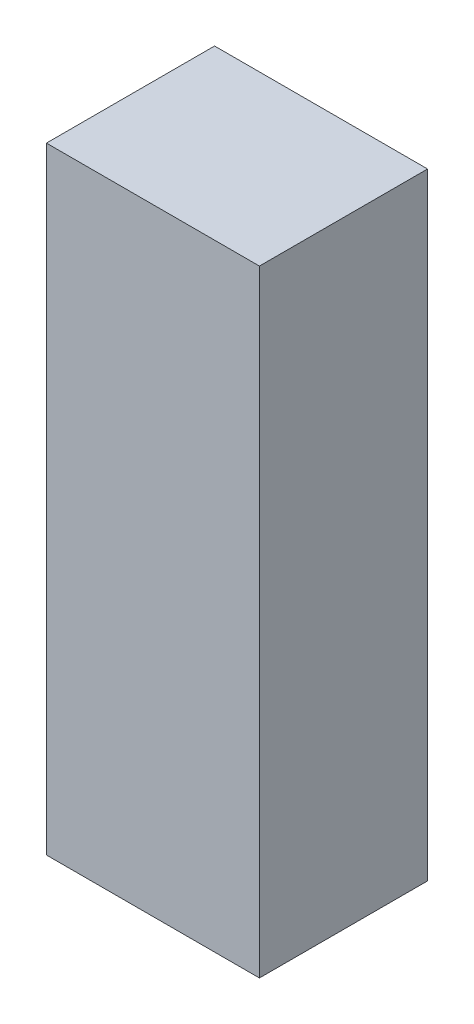
ISO-10303-21;
HEADER;
FILE_DESCRIPTION(('STEP AP214'),'2;1');
FILE_NAME('part.step','',(''),(''),'','','');
FILE_SCHEMA(('AUTOMOTIVE_DESIGN { 1 0 10303 214 1 1 1 1 }'));
ENDSEC;
DATA;
#1=APPLICATION_CONTEXT('core data for automotive mechanical design processes');
#2=APPLICATION_PROTOCOL_DEFINITION('international standard','automotive_design',2000,#1);
#3=PRODUCT_CONTEXT('',#1,'mechanical');
#4=PRODUCT('Part','Part','',(#3));
#5=PRODUCT_RELATED_PRODUCT_CATEGORY('part','',(#4));
#6=PRODUCT_DEFINITION_FORMATION('','',#4);
#7=PRODUCT_DEFINITION_CONTEXT('part definition',#1,'design');
#8=PRODUCT_DEFINITION('design','',#6,#7);
#9=PRODUCT_DEFINITION_SHAPE('','',#8);
#10=(LENGTH_UNIT() NAMED_UNIT(*) SI_UNIT(.MILLI.,.METRE.));
#11=(NAMED_UNIT(*) PLANE_ANGLE_UNIT() SI_UNIT($,.RADIAN.));
#12=(NAMED_UNIT(*) SI_UNIT($,.STERADIAN.) SOLID_ANGLE_UNIT());
#13=UNCERTAINTY_MEASURE_WITH_UNIT(LENGTH_MEASURE(1.E-05),#10,'distance_accuracy_value','');
#14=(GEOMETRIC_REPRESENTATION_CONTEXT(3) GLOBAL_UNCERTAINTY_ASSIGNED_CONTEXT((#13)) GLOBAL_UNIT_ASSIGNED_CONTEXT((#10,
#11,#12)) REPRESENTATION_CONTEXT('',''));
#15=CARTESIAN_POINT('',(0.,0.,0.));
#16=DIRECTION('',(0.,0.,1.));
#17=DIRECTION('',(1.,0.,0.));
#18=AXIS2_PLACEMENT_3D('',#15,#16,#17);
#19=CARTESIAN_POINT('',(47.5,137.5,-37.5));
#20=DIRECTION('',(-1.,0.,0.));
#21=DIRECTION('',(0.,0.,1.));
#22=AXIS2_PLACEMENT_3D('',#19,#20,#21);
#23=PLANE('',#22);
#24=DIRECTION('',(0.,0.,-1.));
#25=VECTOR('',#24,1.);
#26=CARTESIAN_POINT('',(47.5,-137.5,-37.5));
#27=LINE('',#26,#25);
#28=CARTESIAN_POINT('',(47.5,-137.5,37.5));
#29=VERTEX_POINT('',#28);
#30=CARTESIAN_POINT('',(47.5,-137.5,-37.5));
#31=VERTEX_POINT('',#30);
#32=EDGE_CURVE('E96',#29,#31,#27,.T.);
#33=ORIENTED_EDGE('',*,*,#32,.T.);
#34=DIRECTION('',(0.,-1.,0.));
#35=VECTOR('',#34,1.);
#36=CARTESIAN_POINT('',(47.5,137.5,-37.5));
#37=LINE('',#36,#35);
#38=CARTESIAN_POINT('',(47.5,137.5,-37.5));
#39=VERTEX_POINT('',#38);
#40=EDGE_CURVE('E11',#39,#31,#37,.T.);
#41=ORIENTED_EDGE('',*,*,#40,.F.);
#42=DIRECTION('',(0.,0.,-1.));
#43=VECTOR('',#42,1.);
#44=CARTESIAN_POINT('',(47.5,137.5,-37.5));
#45=LINE('',#44,#43);
#46=CARTESIAN_POINT('',(47.5,137.5,37.5));
#47=VERTEX_POINT('',#46);
#48=EDGE_CURVE('E84',#47,#39,#45,.T.);
#49=ORIENTED_EDGE('',*,*,#48,.F.);
#50=DIRECTION('',(0.,-1.,0.));
#51=VECTOR('',#50,1.);
#52=CARTESIAN_POINT('',(47.5,137.5,37.5));
#53=LINE('',#52,#51);
#54=EDGE_CURVE('E92',#47,#29,#53,.T.);
#55=ORIENTED_EDGE('',*,*,#54,.T.);
#56=EDGE_LOOP('',(#33,#41,#49,#55));
#57=FACE_BOUND('',#56,.T.);
#58=ADVANCED_FACE('F33',(#57),#23,.F.);
#59=CARTESIAN_POINT('',(-47.5,137.5,-37.5));
#60=DIRECTION('',(0.,0.,1.));
#61=DIRECTION('',(1.,0.,0.));
#62=AXIS2_PLACEMENT_3D('',#59,#60,#61);
#63=PLANE('',#62);
#64=DIRECTION('',(-1.,0.,0.));
#65=VECTOR('',#64,1.);
#66=CARTESIAN_POINT('',(-47.5,-137.5,-37.5));
#67=LINE('',#66,#65);
#68=CARTESIAN_POINT('',(-47.5,-137.5,-37.5));
#69=VERTEX_POINT('',#68);
#70=EDGE_CURVE('E88',#31,#69,#67,.T.);
#71=ORIENTED_EDGE('',*,*,#70,.T.);
#72=DIRECTION('',(0.,-1.,0.));
#73=VECTOR('',#72,1.);
#74=CARTESIAN_POINT('',(-47.5,137.5,-37.5));
#75=LINE('',#74,#73);
#76=CARTESIAN_POINT('',(-47.5,137.5,-37.5));
#77=VERTEX_POINT('',#76);
#78=EDGE_CURVE('E41',#77,#69,#75,.T.);
#79=ORIENTED_EDGE('',*,*,#78,.F.);
#80=DIRECTION('',(-1.,0.,0.));
#81=VECTOR('',#80,1.);
#82=CARTESIAN_POINT('',(-47.5,137.5,-37.5));
#83=LINE('',#82,#81);
#84=EDGE_CURVE('E79',#39,#77,#83,.T.);
#85=ORIENTED_EDGE('',*,*,#84,.F.);
#86=ORIENTED_EDGE('',*,*,#40,.T.);
#87=EDGE_LOOP('',(#71,#79,#85,#86));
#88=FACE_BOUND('',#87,.T.);
#89=ADVANCED_FACE('F87',(#88),#63,.F.);
#90=CARTESIAN_POINT('',(-47.5,137.5,-37.5));
#91=DIRECTION('',(1.,0.,0.));
#92=DIRECTION('',(0.,0.,-1.));
#93=AXIS2_PLACEMENT_3D('',#90,#91,#92);
#94=PLANE('',#93);
#95=DIRECTION('',(0.,0.,1.));
#96=VECTOR('',#95,1.);
#97=CARTESIAN_POINT('',(-47.5,-137.5,-37.5));
#98=LINE('',#97,#96);
#99=CARTESIAN_POINT('',(-47.5,-137.5,37.5));
#100=VERTEX_POINT('',#99);
#101=EDGE_CURVE('E66',#69,#100,#98,.T.);
#102=ORIENTED_EDGE('',*,*,#101,.T.);
#103=DIRECTION('',(0.,-1.,0.));
#104=VECTOR('',#103,1.);
#105=CARTESIAN_POINT('',(-47.5,137.5,37.5));
#106=LINE('',#105,#104);
#107=CARTESIAN_POINT('',(-47.5,137.5,37.5));
#108=VERTEX_POINT('',#107);
#109=EDGE_CURVE('E89',#108,#100,#106,.T.);
#110=ORIENTED_EDGE('',*,*,#109,.F.);
#111=DIRECTION('',(0.,0.,1.));
#112=VECTOR('',#111,1.);
#113=CARTESIAN_POINT('',(-47.5,137.5,-37.5));
#114=LINE('',#113,#112);
#115=EDGE_CURVE('E82',#77,#108,#114,.T.);
#116=ORIENTED_EDGE('',*,*,#115,.F.);
#117=ORIENTED_EDGE('',*,*,#78,.T.);
#118=EDGE_LOOP('',(#102,#110,#116,#117));
#119=FACE_BOUND('',#118,.T.);
#120=ADVANCED_FACE('F90',(#119),#94,.F.);
#121=CARTESIAN_POINT('',(-47.5,137.5,37.5));
#122=DIRECTION('',(0.,0.,-1.));
#123=DIRECTION('',(-1.,0.,0.));
#124=AXIS2_PLACEMENT_3D('',#121,#122,#123);
#125=PLANE('',#124);
#126=DIRECTION('',(1.,0.,0.));
#127=VECTOR('',#126,1.);
#128=CARTESIAN_POINT('',(-47.5,-137.5,37.5));
#129=LINE('',#128,#127);
#130=EDGE_CURVE('E72',#100,#29,#129,.T.);
#131=ORIENTED_EDGE('',*,*,#130,.T.);
#132=ORIENTED_EDGE('',*,*,#54,.F.);
#133=DIRECTION('',(1.,0.,0.));
#134=VECTOR('',#133,1.);
#135=CARTESIAN_POINT('',(-47.5,137.5,37.5));
#136=LINE('',#135,#134);
#137=EDGE_CURVE('E49',#108,#47,#136,.T.);
#138=ORIENTED_EDGE('',*,*,#137,.F.);
#139=ORIENTED_EDGE('',*,*,#109,.T.);
#140=EDGE_LOOP('',(#131,#132,#138,#139));
#141=FACE_BOUND('',#140,.T.);
#142=ADVANCED_FACE('F103',(#141),#125,.F.);
#143=CARTESIAN_POINT('',(0.,137.5,0.));
#144=DIRECTION('',(0.,1.,0.));
#145=DIRECTION('',(0.,0.,1.));
#146=AXIS2_PLACEMENT_3D('',#143,#144,#145);
#147=PLANE('',#146);
#148=ORIENTED_EDGE('',*,*,#48,.T.);
#149=ORIENTED_EDGE('',*,*,#84,.T.);
#150=ORIENTED_EDGE('',*,*,#115,.T.);
#151=ORIENTED_EDGE('',*,*,#137,.T.);
#152=EDGE_LOOP('',(#148,#149,#150,#151));
#153=FACE_BOUND('',#152,.T.);
#154=ADVANCED_FACE('F80',(#153),#147,.T.);
#155=CARTESIAN_POINT('',(0.,-137.5,0.));
#156=DIRECTION('',(0.,1.,0.));
#157=DIRECTION('',(0.,0.,1.));
#158=AXIS2_PLACEMENT_3D('',#155,#156,#157);
#159=PLANE('',#158);
#160=ORIENTED_EDGE('',*,*,#32,.F.);
#161=ORIENTED_EDGE('',*,*,#130,.F.);
#162=ORIENTED_EDGE('',*,*,#101,.F.);
#163=ORIENTED_EDGE('',*,*,#70,.F.);
#164=EDGE_LOOP('',(#160,#161,#162,#163));
#165=FACE_BOUND('',#164,.T.);
#166=ADVANCED_FACE('F106',(#165),#159,.F.);
#167=CLOSED_SHELL('',(#58,#89,#120,#142,#154,#166));
#168=MANIFOLD_SOLID_BREP('B2',#167);
#169=ADVANCED_BREP_SHAPE_REPRESENTATION('',(#18,#168),#14);
#170=SHAPE_DEFINITION_REPRESENTATION(#9,#169);
ENDSEC;
END-ISO-10303-21;
